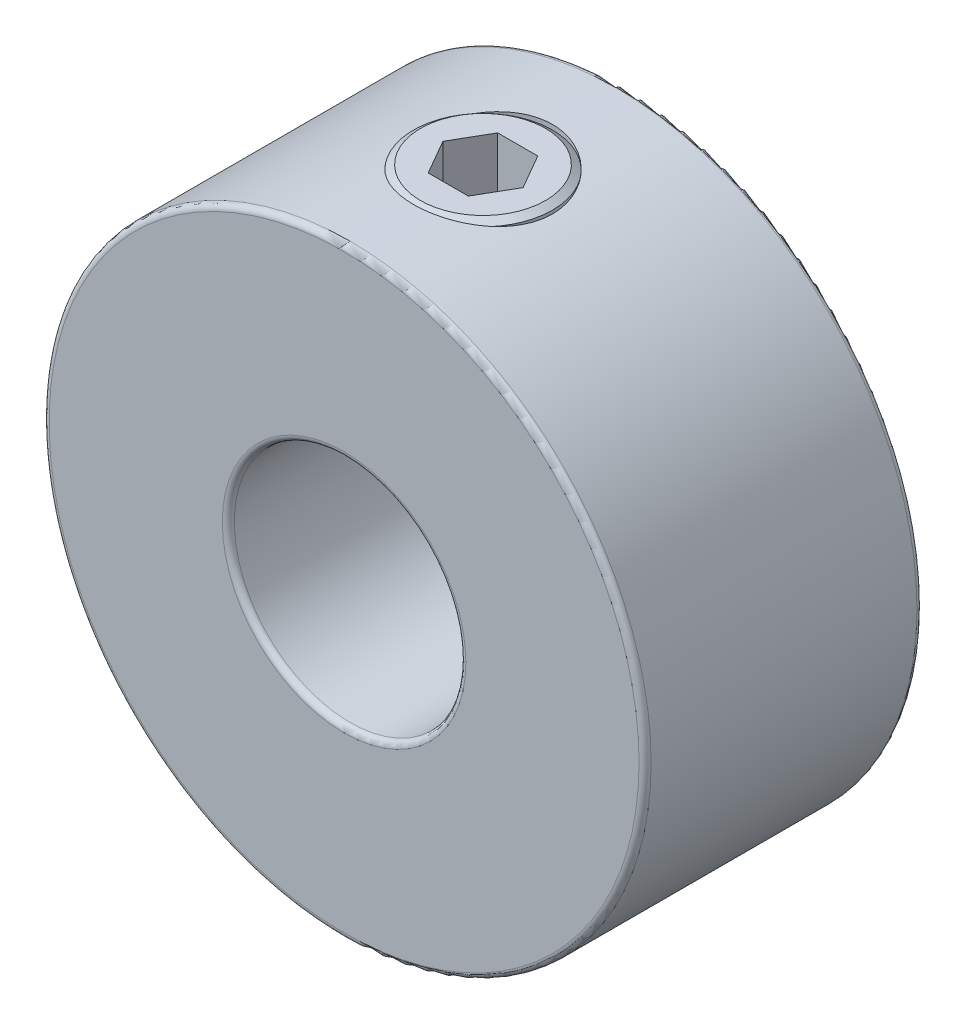
ISO-10303-21;
HEADER;
FILE_DESCRIPTION(('STEP AP214'),'2;1');
FILE_NAME('part.step','',(''),(''),'','','');
FILE_SCHEMA(('AUTOMOTIVE_DESIGN { 1 0 10303 214 1 1 1 1 }'));
ENDSEC;
DATA;
#1=APPLICATION_CONTEXT('core data for automotive mechanical design processes');
#2=APPLICATION_PROTOCOL_DEFINITION('international standard','automotive_design',2000,#1);
#3=PRODUCT_CONTEXT('',#1,'mechanical');
#4=PRODUCT('Part','Part','',(#3));
#5=PRODUCT_RELATED_PRODUCT_CATEGORY('part','',(#4));
#6=PRODUCT_DEFINITION_FORMATION('','',#4);
#7=PRODUCT_DEFINITION_CONTEXT('part definition',#1,'design');
#8=PRODUCT_DEFINITION('design','',#6,#7);
#9=PRODUCT_DEFINITION_SHAPE('','',#8);
#10=(LENGTH_UNIT() NAMED_UNIT(*) SI_UNIT(.MILLI.,.METRE.));
#11=(NAMED_UNIT(*) PLANE_ANGLE_UNIT() SI_UNIT($,.RADIAN.));
#12=(NAMED_UNIT(*) SI_UNIT($,.STERADIAN.) SOLID_ANGLE_UNIT());
#13=UNCERTAINTY_MEASURE_WITH_UNIT(LENGTH_MEASURE(1.E-05),#10,'distance_accuracy_value','');
#14=(GEOMETRIC_REPRESENTATION_CONTEXT(3) GLOBAL_UNCERTAINTY_ASSIGNED_CONTEXT((#13)) GLOBAL_UNIT_ASSIGNED_CONTEXT((#10,
#11,#12)) REPRESENTATION_CONTEXT('',''));
#15=CARTESIAN_POINT('',(0.,0.,0.));
#16=DIRECTION('',(0.,0.,1.));
#17=DIRECTION('',(1.,0.,0.));
#18=AXIS2_PLACEMENT_3D('',#15,#16,#17);
#19=CARTESIAN_POINT('',(0.,4.17805264055722,3.));
#20=DIRECTION('',(0.,1.,0.));
#21=DIRECTION('',(-1.,0.,0.));
#22=AXIS2_PLACEMENT_3D('',#19,#20,#21);
#23=CONICAL_SURFACE('',#22,1.5,0.785398163397449);
#24=CARTESIAN_POINT('',(0.,3.5,3.));
#25=DIRECTION('',(0.,-1.,0.));
#26=DIRECTION('',(1.,0.,0.));
#27=AXIS2_PLACEMENT_3D('',#24,#25,#26);
#28=CIRCLE('',#27,0.821947359442784);
#29=CARTESIAN_POINT('',(0.821947359442786,3.5,3.));
#30=VERTEX_POINT('',#29);
#31=EDGE_CURVE('E12',#30,#30,#28,.T.);
#32=ORIENTED_EDGE('',*,*,#31,.F.);
#33=EDGE_LOOP('',(#32));
#34=FACE_BOUND('',#33,.T.);
#35=CARTESIAN_POINT('',(0.,4.17805264055722,3.));
#36=DIRECTION('',(0.,-1.,0.));
#37=DIRECTION('',(1.,0.,0.));
#38=AXIS2_PLACEMENT_3D('',#35,#36,#37);
#39=CIRCLE('',#38,1.5);
#40=CARTESIAN_POINT('',(1.5,4.17805264055722,3.));
#41=VERTEX_POINT('',#40);
#42=EDGE_CURVE('E143',#41,#41,#39,.T.);
#43=ORIENTED_EDGE('',*,*,#42,.T.);
#44=EDGE_LOOP('',(#43));
#45=FACE_BOUND('',#44,.T.);
#46=ADVANCED_FACE('F44',(#34,#45),#23,.T.);
#47=CARTESIAN_POINT('',(0.,3.5,3.));
#48=DIRECTION('',(0.,-1.,0.));
#49=DIRECTION('',(1.,0.,0.));
#50=AXIS2_PLACEMENT_3D('',#47,#48,#49);
#51=CONICAL_SURFACE('',#50,0.821947359442784,1.02974425867666);
#52=CARTESIAN_POINT('',(0.,3.99387579920286,3.));
#53=VERTEX_POINT('',#52);
#54=VERTEX_LOOP('',#53);
#55=FACE_BOUND('',#54,.T.);
#56=ORIENTED_EDGE('',*,*,#31,.T.);
#57=EDGE_LOOP('',(#56));
#58=FACE_BOUND('',#57,.T.);
#59=ADVANCED_FACE('F162',(#55,#58),#51,.F.);
#60=CARTESIAN_POINT('',(0.,6.5,3.));
#61=DIRECTION('',(0.,-1.,0.));
#62=DIRECTION('',(1.,0.,0.));
#63=AXIS2_PLACEMENT_3D('',#60,#61,#62);
#64=PLANE('',#63);
#65=DIRECTION('',(0.5,0.,0.866025403784439));
#66=VECTOR('',#65,1.);
#67=CARTESIAN_POINT('',(-0.86602540378444,6.5,3.));
#68=LINE('',#67,#66);
#69=CARTESIAN_POINT('',(-0.86602540378444,6.5,3.));
#70=VERTEX_POINT('',#69);
#71=CARTESIAN_POINT('',(-0.43301270189222,6.5,3.75));
#72=VERTEX_POINT('',#71);
#73=EDGE_CURVE('E131',#70,#72,#68,.T.);
#74=ORIENTED_EDGE('',*,*,#73,.F.);
#75=DIRECTION('',(-0.5,0.,0.866025403784439));
#76=VECTOR('',#75,1.);
#77=CARTESIAN_POINT('',(-0.433012701892222,6.5,2.25));
#78=LINE('',#77,#76);
#79=CARTESIAN_POINT('',(-0.433012701892222,6.5,2.25));
#80=VERTEX_POINT('',#79);
#81=EDGE_CURVE('E58',#80,#70,#78,.T.);
#82=ORIENTED_EDGE('',*,*,#81,.F.);
#83=DIRECTION('',(-1.,0.,0.));
#84=VECTOR('',#83,1.);
#85=CARTESIAN_POINT('',(0.433012701892218,6.5,2.25));
#86=LINE('',#85,#84);
#87=CARTESIAN_POINT('',(0.433012701892218,6.5,2.25));
#88=VERTEX_POINT('',#87);
#89=EDGE_CURVE('E117',#88,#80,#86,.T.);
#90=ORIENTED_EDGE('',*,*,#89,.F.);
#91=DIRECTION('',(-0.5,0.,-0.866025403784438));
#92=VECTOR('',#91,1.);
#93=CARTESIAN_POINT('',(0.866025403784437,6.5,3.));
#94=LINE('',#93,#92);
#95=CARTESIAN_POINT('',(0.866025403784437,6.5,3.));
#96=VERTEX_POINT('',#95);
#97=EDGE_CURVE('E120',#96,#88,#94,.T.);
#98=ORIENTED_EDGE('',*,*,#97,.F.);
#99=DIRECTION('',(0.5,0.,-0.866025403784439));
#100=VECTOR('',#99,1.);
#101=CARTESIAN_POINT('',(0.433012701892217,6.5,3.75));
#102=LINE('',#101,#100);
#103=CARTESIAN_POINT('',(0.433012701892217,6.5,3.75));
#104=VERTEX_POINT('',#103);
#105=EDGE_CURVE('E136',#104,#96,#102,.T.);
#106=ORIENTED_EDGE('',*,*,#105,.F.);
#107=DIRECTION('',(1.,0.,0.));
#108=VECTOR('',#107,1.);
#109=CARTESIAN_POINT('',(-0.43301270189222,6.5,3.75));
#110=LINE('',#109,#108);
#111=EDGE_CURVE('E133',#72,#104,#110,.T.);
#112=ORIENTED_EDGE('',*,*,#111,.F.);
#113=EDGE_LOOP('',(#74,#82,#90,#98,#106,#112));
#114=FACE_BOUND('',#113,.T.);
#115=CARTESIAN_POINT('',(0.,6.5,3.));
#116=DIRECTION('',(0.,-1.,0.));
#117=DIRECTION('',(1.,0.,0.));
#118=AXIS2_PLACEMENT_3D('',#115,#116,#117);
#119=CIRCLE('',#118,1.35);
#120=CARTESIAN_POINT('',(1.35,6.5,3.));
#121=VERTEX_POINT('',#120);
#122=EDGE_CURVE('E51',#121,#121,#119,.T.);
#123=ORIENTED_EDGE('',*,*,#122,.F.);
#124=EDGE_LOOP('',(#123));
#125=FACE_BOUND('',#124,.T.);
#126=ADVANCED_FACE('F160',(#114,#125),#64,.F.);
#127=CARTESIAN_POINT('',(0.,6.5,3.));
#128=DIRECTION('',(0.,-1.,0.));
#129=DIRECTION('',(1.,0.,0.));
#130=AXIS2_PLACEMENT_3D('',#127,#128,#129);
#131=CONICAL_SURFACE('',#130,1.35,0.959931088596883);
#132=CARTESIAN_POINT('',(0.,6.39496886926854,3.));
#133=DIRECTION('',(0.,-1.,0.));
#134=DIRECTION('',(1.,0.,0.));
#135=AXIS2_PLACEMENT_3D('',#132,#133,#134);
#136=CIRCLE('',#135,1.5);
#137=CARTESIAN_POINT('',(1.5,6.39496886926855,3.));
#138=VERTEX_POINT('',#137);
#139=EDGE_CURVE('E153',#138,#138,#136,.T.);
#140=ORIENTED_EDGE('',*,*,#139,.F.);
#141=EDGE_LOOP('',(#140));
#142=FACE_BOUND('',#141,.T.);
#143=ORIENTED_EDGE('',*,*,#122,.T.);
#144=EDGE_LOOP('',(#143));
#145=FACE_BOUND('',#144,.T.);
#146=ADVANCED_FACE('F158',(#142,#145),#131,.T.);
#147=CARTESIAN_POINT('',(0.,3.99387579920286,3.));
#148=DIRECTION('',(0.,-1.,0.));
#149=DIRECTION('',(1.,0.,0.));
#150=AXIS2_PLACEMENT_3D('',#147,#148,#149);
#151=CYLINDRICAL_SURFACE('',#150,1.5);
#152=ORIENTED_EDGE('',*,*,#42,.F.);
#153=EDGE_LOOP('',(#152));
#154=FACE_BOUND('',#153,.T.);
#155=ORIENTED_EDGE('',*,*,#139,.T.);
#156=EDGE_LOOP('',(#155));
#157=FACE_BOUND('',#156,.T.);
#158=ADVANCED_FACE('F169',(#154,#157),#151,.T.);
#159=CARTESIAN_POINT('',(-0.433012701892221,5.3,2.25));
#160=DIRECTION('',(-0.866025403784439,0.,-0.5));
#161=DIRECTION('',(-0.5,0.,0.866025403784439));
#162=AXIS2_PLACEMENT_3D('',#159,#160,#161);
#163=PLANE('',#162);
#164=ORIENTED_EDGE('',*,*,#81,.T.);
#165=DIRECTION('',(0.,1.,0.));
#166=VECTOR('',#165,1.);
#167=CARTESIAN_POINT('',(-0.86602540378444,5.3,3.));
#168=LINE('',#167,#166);
#169=CARTESIAN_POINT('',(-0.86602540378444,5.3,3.));
#170=VERTEX_POINT('',#169);
#171=EDGE_CURVE('E94',#170,#70,#168,.T.);
#172=ORIENTED_EDGE('',*,*,#171,.F.);
#173=DIRECTION('',(-0.5,0.,0.866025403784439));
#174=VECTOR('',#173,1.);
#175=CARTESIAN_POINT('',(-0.433012701892221,5.3,2.25));
#176=LINE('',#175,#174);
#177=CARTESIAN_POINT('',(-0.433012701892221,5.3,2.25));
#178=VERTEX_POINT('',#177);
#179=EDGE_CURVE('E98',#178,#170,#176,.T.);
#180=ORIENTED_EDGE('',*,*,#179,.F.);
#181=DIRECTION('',(0.,1.,0.));
#182=VECTOR('',#181,1.);
#183=CARTESIAN_POINT('',(-0.433012701892221,5.3,2.25));
#184=LINE('',#183,#182);
#185=EDGE_CURVE('E141',#178,#80,#184,.T.);
#186=ORIENTED_EDGE('',*,*,#185,.T.);
#187=EDGE_LOOP('',(#164,#172,#180,#186));
#188=FACE_BOUND('',#187,.T.);
#189=ADVANCED_FACE('F96',(#188),#163,.F.);
#190=CARTESIAN_POINT('',(0.433012701892218,5.3,2.25));
#191=DIRECTION('',(0.,0.,-1.));
#192=DIRECTION('',(-1.,0.,0.));
#193=AXIS2_PLACEMENT_3D('',#190,#191,#192);
#194=PLANE('',#193);
#195=ORIENTED_EDGE('',*,*,#89,.T.);
#196=ORIENTED_EDGE('',*,*,#185,.F.);
#197=DIRECTION('',(-1.,0.,0.));
#198=VECTOR('',#197,1.);
#199=CARTESIAN_POINT('',(0.433012701892218,5.3,2.25));
#200=LINE('',#199,#198);
#201=CARTESIAN_POINT('',(0.433012701892218,5.3,2.25));
#202=VERTEX_POINT('',#201);
#203=EDGE_CURVE('E104',#202,#178,#200,.T.);
#204=ORIENTED_EDGE('',*,*,#203,.F.);
#205=DIRECTION('',(0.,1.,0.));
#206=VECTOR('',#205,1.);
#207=CARTESIAN_POINT('',(0.433012701892218,5.3,2.25));
#208=LINE('',#207,#206);
#209=EDGE_CURVE('E144',#202,#88,#208,.T.);
#210=ORIENTED_EDGE('',*,*,#209,.T.);
#211=EDGE_LOOP('',(#195,#196,#204,#210));
#212=FACE_BOUND('',#211,.T.);
#213=ADVANCED_FACE('F187',(#212),#194,.F.);
#214=CARTESIAN_POINT('',(0.866025403784437,5.3,3.));
#215=DIRECTION('',(0.866025403784439,0.,-0.5));
#216=DIRECTION('',(-0.5,0.,-0.866025403784439));
#217=AXIS2_PLACEMENT_3D('',#214,#215,#216);
#218=PLANE('',#217);
#219=ORIENTED_EDGE('',*,*,#97,.T.);
#220=ORIENTED_EDGE('',*,*,#209,.F.);
#221=DIRECTION('',(-0.5,0.,-0.866025403784438));
#222=VECTOR('',#221,1.);
#223=CARTESIAN_POINT('',(0.866025403784437,5.3,3.));
#224=LINE('',#223,#222);
#225=CARTESIAN_POINT('',(0.866025403784437,5.3,3.));
#226=VERTEX_POINT('',#225);
#227=EDGE_CURVE('E127',#226,#202,#224,.T.);
#228=ORIENTED_EDGE('',*,*,#227,.F.);
#229=DIRECTION('',(0.,1.,0.));
#230=VECTOR('',#229,1.);
#231=CARTESIAN_POINT('',(0.866025403784437,5.3,3.));
#232=LINE('',#231,#230);
#233=EDGE_CURVE('E146',#226,#96,#232,.T.);
#234=ORIENTED_EDGE('',*,*,#233,.T.);
#235=EDGE_LOOP('',(#219,#220,#228,#234));
#236=FACE_BOUND('',#235,.T.);
#237=ADVANCED_FACE('F199',(#236),#218,.F.);
#238=CARTESIAN_POINT('',(0.433012701892217,5.3,3.75));
#239=DIRECTION('',(0.866025403784439,0.,0.499999999999999));
#240=DIRECTION('',(0.5,0.,-0.866025403784439));
#241=AXIS2_PLACEMENT_3D('',#238,#239,#240);
#242=PLANE('',#241);
#243=ORIENTED_EDGE('',*,*,#105,.T.);
#244=ORIENTED_EDGE('',*,*,#233,.F.);
#245=DIRECTION('',(0.5,0.,-0.866025403784439));
#246=VECTOR('',#245,1.);
#247=CARTESIAN_POINT('',(0.433012701892217,5.3,3.75));
#248=LINE('',#247,#246);
#249=CARTESIAN_POINT('',(0.433012701892217,5.3,3.75));
#250=VERTEX_POINT('',#249);
#251=EDGE_CURVE('E124',#250,#226,#248,.T.);
#252=ORIENTED_EDGE('',*,*,#251,.F.);
#253=DIRECTION('',(0.,1.,0.));
#254=VECTOR('',#253,1.);
#255=CARTESIAN_POINT('',(0.433012701892217,5.3,3.75));
#256=LINE('',#255,#254);
#257=EDGE_CURVE('E148',#250,#104,#256,.T.);
#258=ORIENTED_EDGE('',*,*,#257,.T.);
#259=EDGE_LOOP('',(#243,#244,#252,#258));
#260=FACE_BOUND('',#259,.T.);
#261=ADVANCED_FACE('F195',(#260),#242,.F.);
#262=CARTESIAN_POINT('',(-0.43301270189222,5.3,3.75));
#263=DIRECTION('',(0.,0.,1.));
#264=DIRECTION('',(1.,0.,0.));
#265=AXIS2_PLACEMENT_3D('',#262,#263,#264);
#266=PLANE('',#265);
#267=ORIENTED_EDGE('',*,*,#111,.T.);
#268=ORIENTED_EDGE('',*,*,#257,.F.);
#269=DIRECTION('',(1.,0.,0.));
#270=VECTOR('',#269,1.);
#271=CARTESIAN_POINT('',(-0.43301270189222,5.3,3.75));
#272=LINE('',#271,#270);
#273=CARTESIAN_POINT('',(-0.43301270189222,5.3,3.75));
#274=VERTEX_POINT('',#273);
#275=EDGE_CURVE('E112',#274,#250,#272,.T.);
#276=ORIENTED_EDGE('',*,*,#275,.F.);
#277=DIRECTION('',(0.,1.,0.));
#278=VECTOR('',#277,1.);
#279=CARTESIAN_POINT('',(-0.43301270189222,5.3,3.75));
#280=LINE('',#279,#278);
#281=EDGE_CURVE('E103',#274,#72,#280,.T.);
#282=ORIENTED_EDGE('',*,*,#281,.T.);
#283=EDGE_LOOP('',(#267,#268,#276,#282));
#284=FACE_BOUND('',#283,.T.);
#285=ADVANCED_FACE('F192',(#284),#266,.F.);
#286=CARTESIAN_POINT('',(-0.86602540378444,5.3,3.));
#287=DIRECTION('',(-0.866025403784439,0.,0.5));
#288=DIRECTION('',(0.5,0.,0.866025403784439));
#289=AXIS2_PLACEMENT_3D('',#286,#287,#288);
#290=PLANE('',#289);
#291=ORIENTED_EDGE('',*,*,#73,.T.);
#292=ORIENTED_EDGE('',*,*,#281,.F.);
#293=DIRECTION('',(0.5,0.,0.866025403784439));
#294=VECTOR('',#293,1.);
#295=CARTESIAN_POINT('',(-0.86602540378444,5.3,3.));
#296=LINE('',#295,#294);
#297=EDGE_CURVE('E107',#170,#274,#296,.T.);
#298=ORIENTED_EDGE('',*,*,#297,.F.);
#299=ORIENTED_EDGE('',*,*,#171,.T.);
#300=EDGE_LOOP('',(#291,#292,#298,#299));
#301=FACE_BOUND('',#300,.T.);
#302=ADVANCED_FACE('F108',(#301),#290,.F.);
#303=CARTESIAN_POINT('',(-1.29903810567666,5.3,3.75));
#304=DIRECTION('',(0.,1.,0.));
#305=DIRECTION('',(0.,0.,1.));
#306=AXIS2_PLACEMENT_3D('',#303,#304,#305);
#307=PLANE('',#306);
#308=ORIENTED_EDGE('',*,*,#179,.T.);
#309=ORIENTED_EDGE('',*,*,#297,.T.);
#310=ORIENTED_EDGE('',*,*,#275,.T.);
#311=ORIENTED_EDGE('',*,*,#251,.T.);
#312=ORIENTED_EDGE('',*,*,#227,.T.);
#313=ORIENTED_EDGE('',*,*,#203,.T.);
#314=EDGE_LOOP('',(#308,#309,#310,#311,#312,#313));
#315=FACE_BOUND('',#314,.T.);
#316=ADVANCED_FACE('F114',(#315),#307,.T.);
#317=CLOSED_SHELL('',(#46,#59,#126,#146,#158,#189,#213,#237,#261,#285,#302,#316));
#318=MANIFOLD_SOLID_BREP('B2',#317);
#319=CARTESIAN_POINT('',(0.,0.,6.));
#320=DIRECTION('',(0.,0.,1.));
#321=DIRECTION('',(1.,0.,0.));
#322=AXIS2_PLACEMENT_3D('',#319,#320,#321);
#323=PLANE('',#322);
#324=CARTESIAN_POINT('',(0.,0.,6.));
#325=DIRECTION('',(0.,0.,1.));
#326=DIRECTION('',(1.,0.,0.));
#327=AXIS2_PLACEMENT_3D('',#324,#325,#326);
#328=CIRCLE('',#327,2.63);
#329=CARTESIAN_POINT('',(2.63,0.,6.));
#330=VERTEX_POINT('',#329);
#331=EDGE_CURVE('E294',#330,#330,#328,.F.);
#332=ORIENTED_EDGE('',*,*,#331,.T.);
#333=EDGE_LOOP('',(#332));
#334=FACE_BOUND('',#333,.T.);
#335=CARTESIAN_POINT('',(0.,0.,6.));
#336=DIRECTION('',(0.,0.,1.));
#337=DIRECTION('',(1.,0.,0.));
#338=AXIS2_PLACEMENT_3D('',#335,#336,#337);
#339=CIRCLE('',#338,6.37);
#340=CARTESIAN_POINT('',(6.37,0.,6.));
#341=VERTEX_POINT('',#340);
#342=EDGE_CURVE('E298',#341,#341,#339,.T.);
#343=ORIENTED_EDGE('',*,*,#342,.T.);
#344=EDGE_LOOP('',(#343));
#345=FACE_BOUND('',#344,.T.);
#346=ADVANCED_FACE('F283',(#334,#345),#323,.T.);
#347=CARTESIAN_POINT('',(0.,0.,0.));
#348=DIRECTION('',(0.,0.,1.));
#349=DIRECTION('',(1.,0.,0.));
#350=AXIS2_PLACEMENT_3D('',#347,#348,#349);
#351=PLANE('',#350);
#352=CARTESIAN_POINT('',(0.,0.,0.));
#353=DIRECTION('',(0.,0.,1.));
#354=DIRECTION('',(1.,0.,0.));
#355=AXIS2_PLACEMENT_3D('',#352,#353,#354);
#356=CIRCLE('',#355,2.63);
#357=CARTESIAN_POINT('',(2.63,0.,0.));
#358=VERTEX_POINT('',#357);
#359=EDGE_CURVE('E309',#358,#358,#356,.T.);
#360=ORIENTED_EDGE('',*,*,#359,.T.);
#361=EDGE_LOOP('',(#360));
#362=FACE_BOUND('',#361,.T.);
#363=CARTESIAN_POINT('',(0.,0.,0.));
#364=DIRECTION('',(0.,0.,1.));
#365=DIRECTION('',(1.,0.,0.));
#366=AXIS2_PLACEMENT_3D('',#363,#364,#365);
#367=CIRCLE('',#366,6.37);
#368=CARTESIAN_POINT('',(6.37,0.,0.));
#369=VERTEX_POINT('',#368);
#370=EDGE_CURVE('E312',#369,#369,#367,.F.);
#371=ORIENTED_EDGE('',*,*,#370,.T.);
#372=EDGE_LOOP('',(#371));
#373=FACE_BOUND('',#372,.T.);
#374=ADVANCED_FACE('F348',(#362,#373),#351,.F.);
#375=CARTESIAN_POINT('',(0.,0.,6.));
#376=DIRECTION('',(0.,0.,-1.));
#377=DIRECTION('',(-1.,0.,0.));
#378=AXIS2_PLACEMENT_3D('',#375,#376,#377);
#379=CYLINDRICAL_SURFACE('',#378,6.5);
#380=CARTESIAN_POINT('',(0.,0.,0.13));
#381=DIRECTION('',(0.,0.,1.));
#382=DIRECTION('',(1.,0.,0.));
#383=AXIS2_PLACEMENT_3D('',#380,#381,#382);
#384=CIRCLE('',#383,6.5);
#385=CARTESIAN_POINT('',(6.5,0.,0.13));
#386=VERTEX_POINT('',#385);
#387=EDGE_CURVE('E43',#386,#386,#384,.T.);
#388=ORIENTED_EDGE('',*,*,#387,.T.);
#389=EDGE_LOOP('',(#388));
#390=FACE_BOUND('',#389,.T.);
#391=CARTESIAN_POINT('',(0.,0.,5.87));
#392=DIRECTION('',(0.,0.,1.));
#393=DIRECTION('',(1.,0.,0.));
#394=AXIS2_PLACEMENT_3D('',#391,#392,#393);
#395=CIRCLE('',#394,6.5);
#396=CARTESIAN_POINT('',(6.5,0.,5.87));
#397=VERTEX_POINT('',#396);
#398=EDGE_CURVE('E290',#397,#397,#395,.F.);
#399=ORIENTED_EDGE('',*,*,#398,.T.);
#400=EDGE_LOOP('',(#399));
#401=FACE_BOUND('',#400,.T.);
#402=CARTESIAN_POINT('',(0.,6.5,4.5));
#403=CARTESIAN_POINT('',(-0.0830761724763343,6.49999849532867,4.49999733464411));
#404=CARTESIAN_POINT('',(-0.166183602986827,6.49839124214546,4.49307507318891));
#405=CARTESIAN_POINT('',(-0.330029933246627,6.49213500375529,4.46560235711435));
#406=CARTESIAN_POINT('',(-0.410767233683362,6.48748401185166,4.4450429115586));
#407=CARTESIAN_POINT('',(-0.567482400649439,6.4756571064677,4.39098030105908));
#408=CARTESIAN_POINT('',(-0.643465410431957,6.46848397910972,4.35749141486865));
#409=CARTESIAN_POINT('',(-0.788732955280501,6.45238316831829,4.27856773493164));
#410=CARTESIAN_POINT('',(-0.858017512835939,6.44345549077589,4.23313298129406));
#411=CARTESIAN_POINT('',(-0.989152353123209,6.42464323305021,4.13075474832276));
#412=CARTESIAN_POINT('',(-1.05086679216121,6.41474568654138,4.07363963829749));
#413=CARTESIAN_POINT('',(-1.16393060397695,6.39519859507266,3.94989007342867));
#414=CARTESIAN_POINT('',(-1.2152789664991,6.38554907436474,3.88325469183953));
#415=CARTESIAN_POINT('',(-1.3067669575256,6.36746174180576,3.74133307243966));
#416=CARTESIAN_POINT('',(-1.34675925477788,6.35904049089481,3.66594955902318));
#417=CARTESIAN_POINT('',(-1.41345395330062,6.34455046029963,3.50930490134943));
#418=CARTESIAN_POINT('',(-1.44015813854148,6.33848136485541,3.4280445477549));
#419=CARTESIAN_POINT('',(-1.4790642425856,6.32951534623235,3.26343419841731));
#420=CARTESIAN_POINT('',(-1.49150809496879,6.32656557105072,3.1801443266252));
#421=CARTESIAN_POINT('',(-1.50229307046533,6.32401364937952,3.01261091295436));
#422=CARTESIAN_POINT('',(-1.50063613156308,6.32441104286173,2.92836750371725));
#423=CARTESIAN_POINT('',(-1.48346063285703,6.32846083321139,2.7631371921762));
#424=CARTESIAN_POINT('',(-1.46822575315178,6.33204661249555,2.68211891865606));
#425=CARTESIAN_POINT('',(-1.42477741479348,6.34196351386388,2.52382020809838));
#426=CARTESIAN_POINT('',(-1.39656315462671,6.34829480548987,2.44654000222292));
#427=CARTESIAN_POINT('',(-1.32770349075046,6.36305332227188,2.29712732835907));
#428=CARTESIAN_POINT('',(-1.28695129246528,6.37149843240945,2.22504591908903));
#429=CARTESIAN_POINT('',(-1.19424748975256,6.38952239681953,2.08864076371062));
#430=CARTESIAN_POINT('',(-1.1422941964553,6.39910142196224,2.02431818974098));
#431=CARTESIAN_POINT('',(-1.02717321086453,6.41859777640792,1.90362604994903));
#432=CARTESIAN_POINT('',(-0.963764950845053,6.42851768847712,1.84748611487504));
#433=CARTESIAN_POINT('',(-0.828318641053405,6.447368160694,1.74659692902464));
#434=CARTESIAN_POINT('',(-0.756280398745029,6.45629869876004,1.70184793245142));
#435=CARTESIAN_POINT('',(-0.60532127797237,6.47219854082993,1.62494408585669));
#436=CARTESIAN_POINT('',(-0.526383143294248,6.47916273202417,1.59282198430734));
#437=CARTESIAN_POINT('',(-0.364032396252582,6.49030757986402,1.54236385630495));
#438=CARTESIAN_POINT('',(-0.280620512374237,6.49448868821629,1.52402559261153));
#439=CARTESIAN_POINT('',(-0.113657323931639,6.49953102945198,1.50199584965186));
#440=CARTESIAN_POINT('',(-0.0301494450127285,6.50046326526885,1.49799106394027));
#441=CARTESIAN_POINT('',(0.136342371579224,6.49910299913129,1.50388901475928));
#442=CARTESIAN_POINT('',(0.219326348562746,6.49681074208307,1.513790695068));
#443=CARTESIAN_POINT('',(0.381357903798024,6.48930412349636,1.54696119660577));
#444=CARTESIAN_POINT('',(0.4604414648757,6.48412623941868,1.57006324131714));
#445=CARTESIAN_POINT('',(0.613609622481665,6.47142910428788,1.62879158892437));
#446=CARTESIAN_POINT('',(0.687693760726587,6.4639096389422,1.66441903813585));
#447=CARTESIAN_POINT('',(0.830037615110187,6.44718996088191,1.74782264392098));
#448=CARTESIAN_POINT('',(0.898188410296326,6.43796535296184,1.7957796918852));
#449=CARTESIAN_POINT('',(1.02558718048179,6.41890391913981,1.90224561735856));
#450=CARTESIAN_POINT('',(1.08483385664762,6.40906700421673,1.96075603154156));
#451=CARTESIAN_POINT('',(1.19400102833017,6.38964047483402,2.08811238587903));
#452=CARTESIAN_POINT('',(1.24370343589042,6.38006017503739,2.1571469646774));
#453=CARTESIAN_POINT('',(1.33081235446409,6.36246188496285,2.30276588021528));
#454=CARTESIAN_POINT('',(1.3682194122462,6.35444382521927,2.37934988103845));
#455=CARTESIAN_POINT('',(1.42941066868129,6.34095951164845,2.53747598842252));
#456=CARTESIAN_POINT('',(1.45327404481082,6.33547846174878,2.61898612968344));
#457=CARTESIAN_POINT('',(1.48692530676327,6.3276660054956,2.78500399284777));
#458=CARTESIAN_POINT('',(1.49671574099563,6.32533402889436,2.86951116919002));
#459=CARTESIAN_POINT('',(1.50182536015786,6.32412253425542,3.03691822705262));
#460=CARTESIAN_POINT('',(1.49749127871471,6.32516029248235,3.11980711064856));
#461=CARTESIAN_POINT('',(1.47525685980881,6.33038270361014,3.28363867866818));
#462=CARTESIAN_POINT('',(1.45735672124418,6.33456731037362,3.36458139160761));
#463=CARTESIAN_POINT('',(1.40867420720143,6.34556939165105,3.52190991079113));
#464=CARTESIAN_POINT('',(1.37794771033572,6.35237543592818,3.59831386070586));
#465=CARTESIAN_POINT('',(1.304530822271,6.36785683112448,3.74493180654133));
#466=CARTESIAN_POINT('',(1.26183902581514,6.37653240158127,3.81514507412735));
#467=CARTESIAN_POINT('',(1.16457679516263,6.39501829374306,3.94908552859008));
#468=CARTESIAN_POINT('',(1.10976162033287,6.4048496868242,4.01263211954958));
#469=CARTESIAN_POINT('',(0.990297714593212,6.42440402438128,4.12973824763829));
#470=CARTESIAN_POINT('',(0.92564669602438,6.43412694306169,4.18329545493028));
#471=CARTESIAN_POINT('',(0.787191932761554,6.45253999299533,4.27966726794881));
#472=CARTESIAN_POINT('',(0.713266869084886,6.46121270567525,4.32231111828978));
#473=CARTESIAN_POINT('',(0.559109641475368,6.47637045552876,4.39449914940861));
#474=CARTESIAN_POINT('',(0.478882547101934,6.48285722936411,4.42405373510293));
#475=CARTESIAN_POINT('',(0.332210374198768,6.49182723396726,4.46427847355574));
#476=CARTESIAN_POINT('',(0.266526367321008,6.494872289668,4.477647271027));
#477=CARTESIAN_POINT('',(0.133901630280835,6.4989592245111,4.49550886661472));
#478=CARTESIAN_POINT('',(0.0669609687898304,6.5000012127936,4.50000214832734));
#479=CARTESIAN_POINT('',(0.,6.5,4.5));
#480=B_SPLINE_CURVE_WITH_KNOTS('',3,(#402,#403,#404,#405,#406,#407,#408,#409,#410,#411,#412,
#413,#414,#415,#416,#417,#418,#419,#420,#421,#422,#423,#424,#425,#426,#427,#428,#429,#430,#431,
#432,#433,#434,#435,#436,#437,#438,#439,#440,#441,#442,#443,#444,#445,#446,#447,#448,#449,#450,
#451,#452,#453,#454,#455,#456,#457,#458,#459,#460,#461,#462,#463,#464,#465,#466,#467,#468,#469,
#470,#471,#472,#473,#474,#475,#476,#477,#478,#479),.UNSPECIFIED.,.T.,.F.,(4,2,2,2,2,2,2,2,2,2,2,
2,2,2,2,2,2,2,2,2,2,2,2,2,2,2,2,2,2,2,2,2,2,2,2,2,2,2,4),(0.,0.248983311217114,
0.498130939431098,0.747004202472747,0.995876629917202,1.24870930222222,1.50156660317464,
1.75756840109411,2.0135358206962,2.26509316141456,2.51661592915602,2.76300377758328,
3.00940684320484,3.25796969712265,3.50657005489342,3.7611752627951,4.01578615203542,
4.27105309773002,4.52627860236006,4.77589001432915,5.02548246887371,5.27198911757477,
5.51851833225481,5.76889433751052,6.01930682944867,6.27489540554877,6.53047261420161,
6.7845398863154,7.03856114466416,7.28639401438666,7.53422325058917,7.7809838930653,
8.02777352833801,8.28009323709707,8.53247172133002,8.78858609727296,9.04449651578221,
9.24519271684376,9.44587798236134),.UNSPECIFIED.);
#481=CARTESIAN_POINT('',(0.,6.5,4.5));
#482=VERTEX_POINT('',#481);
#483=EDGE_CURVE('E315',#482,#482,#480,.T.);
#484=ORIENTED_EDGE('',*,*,#483,.T.);
#485=EDGE_LOOP('',(#484));
#486=FACE_BOUND('',#485,.T.);
#487=ADVANCED_FACE('F344',(#390,#401,#486),#379,.T.);
#488=CARTESIAN_POINT('',(0.,0.,6.));
#489=DIRECTION('',(0.,0.,-1.));
#490=DIRECTION('',(-1.,0.,0.));
#491=AXIS2_PLACEMENT_3D('',#488,#489,#490);
#492=CYLINDRICAL_SURFACE('',#491,2.5);
#493=CARTESIAN_POINT('',(0.,0.,0.13));
#494=DIRECTION('',(0.,0.,1.));
#495=DIRECTION('',(1.,0.,0.));
#496=AXIS2_PLACEMENT_3D('',#493,#494,#495);
#497=CIRCLE('',#496,2.5);
#498=CARTESIAN_POINT('',(2.5,0.,0.13));
#499=VERTEX_POINT('',#498);
#500=EDGE_CURVE('E303',#499,#499,#497,.F.);
#501=ORIENTED_EDGE('',*,*,#500,.T.);
#502=EDGE_LOOP('',(#501));
#503=FACE_BOUND('',#502,.T.);
#504=CARTESIAN_POINT('',(0.,0.,5.87));
#505=DIRECTION('',(0.,0.,1.));
#506=DIRECTION('',(1.,0.,0.));
#507=AXIS2_PLACEMENT_3D('',#504,#505,#506);
#508=CIRCLE('',#507,2.5);
#509=CARTESIAN_POINT('',(2.5,0.,5.87));
#510=VERTEX_POINT('',#509);
#511=EDGE_CURVE('E306',#510,#510,#508,.T.);
#512=ORIENTED_EDGE('',*,*,#511,.T.);
#513=EDGE_LOOP('',(#512));
#514=FACE_BOUND('',#513,.T.);
#515=CARTESIAN_POINT('',(0.,2.5,4.5));
#516=CARTESIAN_POINT('',(-0.0767298334620158,2.49999625789732,4.49999590899012));
#517=CARTESIAN_POINT('',(-0.153582320644178,2.4964290461501,4.49407132907374));
#518=CARTESIAN_POINT('',(-0.304975509530679,2.48249903608568,4.47067568048467));
#519=CARTESIAN_POINT('',(-0.379510034596047,2.47211948032719,4.45317613814578));
#520=CARTESIAN_POINT('',(-0.523751827790837,2.44561558054488,4.40761363883314));
#521=CARTESIAN_POINT('',(-0.593481028226566,2.42951973272944,4.37960304183684));
#522=CARTESIAN_POINT('',(-0.727030318214659,2.39295367626407,4.31413966685897));
#523=CARTESIAN_POINT('',(-0.790851869416383,2.37248455380255,4.27668923303125));
#524=CARTESIAN_POINT('',(-0.916299278999315,2.32705360719088,4.19022517329142));
#525=CARTESIAN_POINT('',(-0.977384020081415,2.30186792195985,4.14054630464861));
#526=CARTESIAN_POINT('',(-1.09088270411891,2.25030439279634,4.03253279617173));
#527=CARTESIAN_POINT('',(-1.14328534948112,2.22392505153571,3.97418706281268));
#528=CARTESIAN_POINT('',(-1.24444996762974,2.1691106699591,3.84207648950327));
#529=CARTESIAN_POINT('',(-1.29197766378809,2.14082017703649,3.76729822901871));
#530=CARTESIAN_POINT('',(-1.37361437764896,2.08938301412124,3.60915342675689));
#531=CARTESIAN_POINT('',(-1.4077451733516,2.06622802273938,3.52580110375243));
#532=CARTESIAN_POINT('',(-1.45440601714221,2.0335462966093,3.37340354934676));
#533=CARTESIAN_POINT('',(-1.47016197246826,2.02207883137591,3.30576400138968));
#534=CARTESIAN_POINT('',(-1.49216172340475,2.00590308295503,3.16819628416964));
#535=CARTESIAN_POINT('',(-1.49841734556836,2.0011863964376,3.09827107124551));
#536=CARTESIAN_POINT('',(-1.50105508796009,1.99920922463856,2.95798850578267));
#537=CARTESIAN_POINT('',(-1.49741783408419,2.00196337012718,2.8876305749068));
#538=CARTESIAN_POINT('',(-1.48046060478828,2.01453261443741,2.74872122457241));
#539=CARTESIAN_POINT('',(-1.46713334620103,2.02435302432226,2.68017120415256));
#540=CARTESIAN_POINT('',(-1.43173921881792,2.04953186944258,2.5474697578719));
#541=CARTESIAN_POINT('',(-1.40978748666087,2.06481711652537,2.48327294607552));
#542=CARTESIAN_POINT('',(-1.35795061770837,2.09927051350828,2.35930500907188));
#543=CARTESIAN_POINT('',(-1.32806257259705,2.11844008623465,2.29953551657608));
#544=CARTESIAN_POINT('',(-1.25517983184583,2.16255327268985,2.1750159028772));
#545=CARTESIAN_POINT('',(-1.21080724397723,2.18792043372992,2.11122190704507));
#546=CARTESIAN_POINT('',(-1.11291092784003,2.23930599764381,1.99132351633299));
#547=CARTESIAN_POINT('',(-1.05937845100579,2.26532500262149,1.9352265660235));
#548=CARTESIAN_POINT('',(-0.935811834382966,2.31935504958317,1.82438701817824));
#549=CARTESIAN_POINT('',(-0.864517682704956,2.34713836268532,1.77092269398401));
#550=CARTESIAN_POINT('',(-0.712276050458999,2.39772428433981,1.67687795280209));
#551=CARTESIAN_POINT('',(-0.631333763943564,2.42052955425515,1.63629064621005));
#552=CARTESIAN_POINT('',(-0.467197585268206,2.45730392066151,1.5720678172041));
#553=CARTESIAN_POINT('',(-0.38446762417358,2.47173957439704,1.54752464428409));
#554=CARTESIAN_POINT('',(-0.215047895144639,2.49218842813551,1.51298880259462));
#555=CARTESIAN_POINT('',(-0.128363005661319,2.49821172952738,1.50297868224643));
#556=CARTESIAN_POINT('',(0.0337146143773964,2.5009057037461,1.49849215232169));
#557=CARTESIAN_POINT('',(0.109042473418718,2.49873521714286,1.50209114491483));
#558=CARTESIAN_POINT('',(0.25782940198606,2.48778712087049,1.52042585307192));
#559=CARTESIAN_POINT('',(0.331288509376106,2.47900964518037,1.53516134280581));
#560=CARTESIAN_POINT('',(0.472574932157613,2.4559479244219,1.57454343281246));
#561=CARTESIAN_POINT('',(0.540495750928484,2.44180275662555,1.59894034907347));
#562=CARTESIAN_POINT('',(0.671265749087263,2.40913880862845,1.65667737636527));
#563=CARTESIAN_POINT('',(0.734113924963909,2.39061916586511,1.69001925134667));
#564=CARTESIAN_POINT('',(0.860006262823864,2.3484549623736,1.76855697920871));
#565=CARTESIAN_POINT('',(0.922394150456837,2.3244780273988,1.81462382907839));
#566=CARTESIAN_POINT('',(1.03902603131014,2.27474265574732,1.91539139348862));
#567=CARTESIAN_POINT('',(1.09326040273738,2.2489821658636,1.97010215485254));
#568=CARTESIAN_POINT('',(1.19931996735579,2.19445423909891,2.09491039003715));
#569=CARTESIAN_POINT('',(1.24991019630915,2.16573241746291,2.1660838854655));
#570=CARTESIAN_POINT('',(1.33845238915668,2.1121618206671,2.3172160245682));
#571=CARTESIAN_POINT('',(1.37641766769781,2.0873089799769,2.39716529389279));
#572=CARTESIAN_POINT('',(1.43142578795776,2.04984909240519,2.54624302230669));
#573=CARTESIAN_POINT('',(1.4512162533619,2.03575659328729,2.61398031235859));
#574=CARTESIAN_POINT('',(1.48113663905972,2.01409605743544,2.75253207808011));
#575=CARTESIAN_POINT('',(1.49127995297631,2.00651897642721,2.82334214432783));
#576=CARTESIAN_POINT('',(1.50134130416631,1.99900446616268,2.96637694759703));
#577=CARTESIAN_POINT('',(1.50122089107869,1.99909576445937,3.03860599068704));
#578=CARTESIAN_POINT('',(1.49066472959328,2.0069771789285,3.18189443560946));
#579=CARTESIAN_POINT('',(1.48022337215759,2.0147714813882,3.2529531800806));
#580=CARTESIAN_POINT('',(1.45040174148913,2.0363318524298,3.38848841757219));
#581=CARTESIAN_POINT('',(1.43147636845351,2.04979211805581,3.45311709430687));
#582=CARTESIAN_POINT('',(1.38563242076993,2.08105501960152,3.57833725447422));
#583=CARTESIAN_POINT('',(1.35871083588479,2.09885929040482,3.63892720696055));
#584=CARTESIAN_POINT('',(1.29289245555732,2.14012990550917,3.76431985722078));
#585=CARTESIAN_POINT('',(1.25279167675753,2.1640458758264,3.82834110385431));
#586=CARTESIAN_POINT('',(1.16375698389084,2.21320127030768,3.94938007261729));
#587=CARTESIAN_POINT('',(1.11481579607798,2.23844177205021,4.00639196215256));
#588=CARTESIAN_POINT('',(1.00009777425734,2.29225690291476,4.12135094913167));
#589=CARTESIAN_POINT('',(0.932876819313904,2.32070308663658,4.17793107489619));
#590=CARTESIAN_POINT('',(0.788462434445589,2.37365428872367,4.27909785586331));
#591=CARTESIAN_POINT('',(0.71126544450154,2.39815789310936,4.32368021198479));
#592=CARTESIAN_POINT('',(0.551125230801453,2.43985578654394,4.39778580757374));
#593=CARTESIAN_POINT('',(0.468430086957213,2.45725077479787,4.42772806492683));
#594=CARTESIAN_POINT('',(0.297973306118807,2.48366273001246,4.47272469521098));
#595=CARTESIAN_POINT('',(0.210232099648612,2.49271125871485,4.48783516785699));
#596=CARTESIAN_POINT('',(0.101558096917535,2.49802001168187,4.49669745470866));
#597=CARTESIAN_POINT('',(0.0812762590282765,2.49876114656362,4.4979344173061));
#598=CARTESIAN_POINT('',(0.0406658206871116,2.49975164517367,4.49958624637086));
#599=CARTESIAN_POINT('',(0.0203372186375691,2.50000099184316,4.5000010843209));
#600=CARTESIAN_POINT('',(0.,2.5,4.5));
#601=B_SPLINE_CURVE_WITH_KNOTS('',3,(#515,#516,#517,#518,#519,#520,#521,#522,#523,#524,#525,
#526,#527,#528,#529,#530,#531,#532,#533,#534,#535,#536,#537,#538,#539,#540,#541,#542,#543,#544,
#545,#546,#547,#548,#549,#550,#551,#552,#553,#554,#555,#556,#557,#558,#559,#560,#561,#562,#563,
#564,#565,#566,#567,#568,#569,#570,#571,#572,#573,#574,#575,#576,#577,#578,#579,#580,#581,#582,
#583,#584,#585,#586,#587,#588,#589,#590,#591,#592,#593,#594,#595,#596,#597,#598,#599,#600),
.UNSPECIFIED.,.T.,.F.,(4,2,2,2,2,2,2,2,2,2,2,2,2,2,2,2,2,2,2,2,2,2,2,2,2,2,2,2,2,2,2,2,2,2,2,2,
2,2,2,2,2,2,4),(0.,0.230102237548649,0.460772627520012,0.690308884600012,0.919788197992274,
1.16681590732472,1.414162579348,1.69183813189807,1.96906040692092,2.17933829855633,
2.38935420916578,2.59978170870726,2.81036753273872,3.01823267593207,3.22617409809868,
3.47046995225163,3.71500044803674,3.99360957884691,4.27206939275324,4.53296790696559,
4.79355286918236,5.01875602722426,5.24395461863455,5.46367785689772,5.68344445659025,
5.92601365818362,6.16886690081836,6.44336762428009,6.71757792616456,6.93257787314692,
7.14727888733318,7.36278425777433,7.57840681155725,7.78364098331142,7.98895251523035,
8.22578610052286,8.46281544370208,8.73854311775519,9.01436946031985,9.28175654462677,
9.54812832184448,9.60911473335177,9.6701032602764),.UNSPECIFIED.);
#602=CARTESIAN_POINT('',(0.,2.5,4.5));
#603=VERTEX_POINT('',#602);
#604=EDGE_CURVE('E316',#603,#603,#601,.T.);
#605=ORIENTED_EDGE('',*,*,#604,.F.);
#606=EDGE_LOOP('',(#605));
#607=FACE_BOUND('',#606,.T.);
#608=ADVANCED_FACE('F328',(#503,#514,#607),#492,.F.);
#609=CARTESIAN_POINT('',(0.,-4.24264068711928,3.));
#610=DIRECTION('',(0.,1.,0.));
#611=DIRECTION('',(0.,0.,1.));
#612=AXIS2_PLACEMENT_3D('',#609,#610,#611);
#613=CYLINDRICAL_SURFACE('',#612,1.5);
#614=ORIENTED_EDGE('',*,*,#604,.T.);
#615=EDGE_LOOP('',(#614));
#616=FACE_BOUND('',#615,.T.);
#617=ORIENTED_EDGE('',*,*,#483,.F.);
#618=EDGE_LOOP('',(#617));
#619=FACE_BOUND('',#618,.T.);
#620=ADVANCED_FACE('F331',(#616,#619),#613,.F.);
#621=CARTESIAN_POINT('',(0.,0.,0.13));
#622=DIRECTION('',(0.,0.,1.));
#623=DIRECTION('',(1.,0.,0.));
#624=AXIS2_PLACEMENT_3D('',#621,#622,#623);
#625=TOROIDAL_SURFACE('',#624,2.63,0.13);
#626=ORIENTED_EDGE('',*,*,#500,.F.);
#627=EDGE_LOOP('',(#626));
#628=FACE_BOUND('',#627,.T.);
#629=ORIENTED_EDGE('',*,*,#359,.F.);
#630=EDGE_LOOP('',(#629));
#631=FACE_BOUND('',#630,.T.);
#632=ADVANCED_FACE('F334',(#628,#631),#625,.T.);
#633=CARTESIAN_POINT('',(0.,0.,5.87));
#634=DIRECTION('',(0.,0.,1.));
#635=DIRECTION('',(1.,0.,0.));
#636=AXIS2_PLACEMENT_3D('',#633,#634,#635);
#637=TOROIDAL_SURFACE('',#636,2.63,0.13);
#638=ORIENTED_EDGE('',*,*,#331,.F.);
#639=EDGE_LOOP('',(#638));
#640=FACE_BOUND('',#639,.T.);
#641=ORIENTED_EDGE('',*,*,#511,.F.);
#642=EDGE_LOOP('',(#641));
#643=FACE_BOUND('',#642,.T.);
#644=ADVANCED_FACE('F341',(#640,#643),#637,.T.);
#645=CARTESIAN_POINT('',(0.,0.,0.13));
#646=DIRECTION('',(0.,0.,1.));
#647=DIRECTION('',(1.,0.,0.));
#648=AXIS2_PLACEMENT_3D('',#645,#646,#647);
#649=TOROIDAL_SURFACE('',#648,6.37,0.13);
#650=ORIENTED_EDGE('',*,*,#370,.F.);
#651=EDGE_LOOP('',(#650));
#652=FACE_BOUND('',#651,.T.);
#653=ORIENTED_EDGE('',*,*,#387,.F.);
#654=EDGE_LOOP('',(#653));
#655=FACE_BOUND('',#654,.T.);
#656=ADVANCED_FACE('F360',(#652,#655),#649,.T.);
#657=CARTESIAN_POINT('',(0.,0.,5.87));
#658=DIRECTION('',(0.,0.,1.));
#659=DIRECTION('',(1.,0.,0.));
#660=AXIS2_PLACEMENT_3D('',#657,#658,#659);
#661=TOROIDAL_SURFACE('',#660,6.37,0.13);
#662=ORIENTED_EDGE('',*,*,#398,.F.);
#663=EDGE_LOOP('',(#662));
#664=FACE_BOUND('',#663,.T.);
#665=ORIENTED_EDGE('',*,*,#342,.F.);
#666=EDGE_LOOP('',(#665));
#667=FACE_BOUND('',#666,.T.);
#668=ADVANCED_FACE('F285',(#664,#667),#661,.T.);
#669=CLOSED_SHELL('',(#346,#374,#487,#608,#620,#632,#644,#656,#668));
#670=MANIFOLD_SOLID_BREP('B6',#669);
#671=ADVANCED_BREP_SHAPE_REPRESENTATION('',(#18,#318,#670),#14);
#672=SHAPE_DEFINITION_REPRESENTATION(#9,#671);
ENDSEC;
END-ISO-10303-21;
